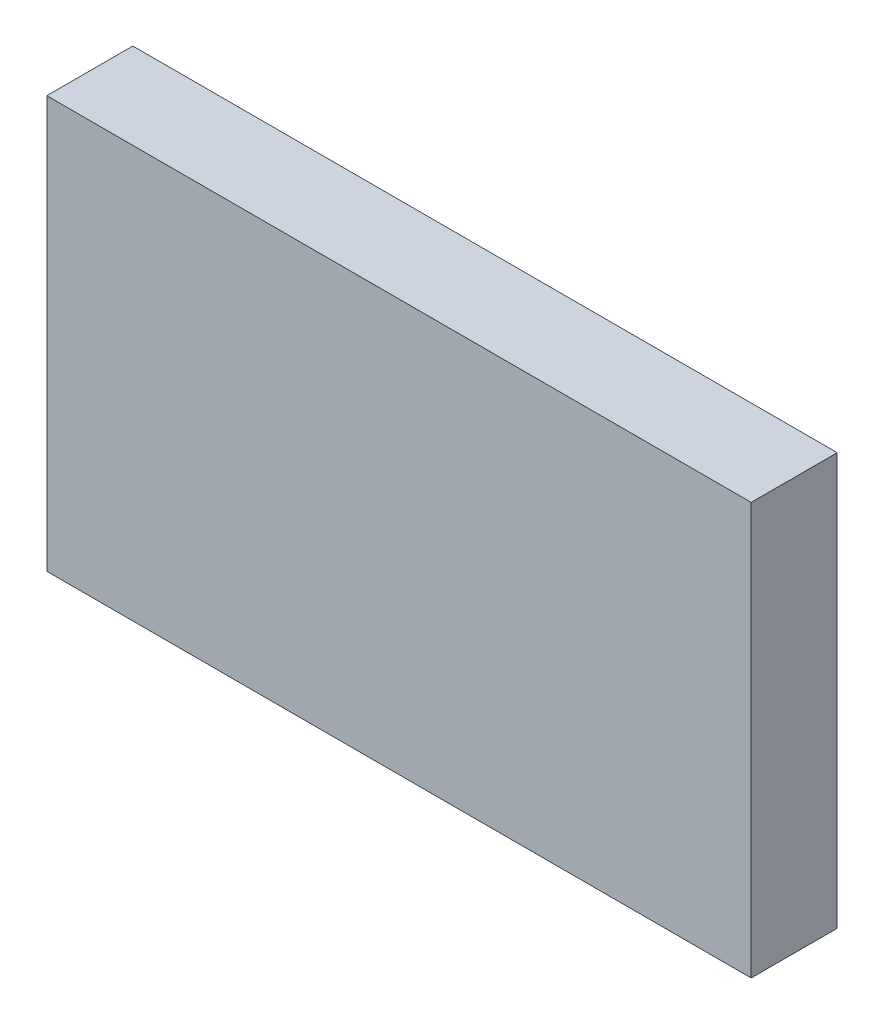
ISO-10303-21;
HEADER;
FILE_DESCRIPTION(('STEP AP214'),'2;1');
FILE_NAME('part.step','',(''),(''),'','','');
FILE_SCHEMA(('AUTOMOTIVE_DESIGN { 1 0 10303 214 1 1 1 1 }'));
ENDSEC;
DATA;
#1=APPLICATION_CONTEXT('core data for automotive mechanical design processes');
#2=APPLICATION_PROTOCOL_DEFINITION('international standard','automotive_design',2000,#1);
#3=PRODUCT_CONTEXT('',#1,'mechanical');
#4=PRODUCT('Part','Part','',(#3));
#5=PRODUCT_RELATED_PRODUCT_CATEGORY('part','',(#4));
#6=PRODUCT_DEFINITION_FORMATION('','',#4);
#7=PRODUCT_DEFINITION_CONTEXT('part definition',#1,'design');
#8=PRODUCT_DEFINITION('design','',#6,#7);
#9=PRODUCT_DEFINITION_SHAPE('','',#8);
#10=(LENGTH_UNIT() NAMED_UNIT(*) SI_UNIT(.MILLI.,.METRE.));
#11=(NAMED_UNIT(*) PLANE_ANGLE_UNIT() SI_UNIT($,.RADIAN.));
#12=(NAMED_UNIT(*) SI_UNIT($,.STERADIAN.) SOLID_ANGLE_UNIT());
#13=UNCERTAINTY_MEASURE_WITH_UNIT(LENGTH_MEASURE(1.E-05),#10,'distance_accuracy_value','');
#14=(GEOMETRIC_REPRESENTATION_CONTEXT(3) GLOBAL_UNCERTAINTY_ASSIGNED_CONTEXT((#13)) GLOBAL_UNIT_ASSIGNED_CONTEXT((#10,
#11,#12)) REPRESENTATION_CONTEXT('',''));
#15=CARTESIAN_POINT('',(0.,0.,0.));
#16=DIRECTION('',(0.,0.,1.));
#17=DIRECTION('',(1.,0.,0.));
#18=AXIS2_PLACEMENT_3D('',#15,#16,#17);
#19=CARTESIAN_POINT('',(-1.03979726,0.6079998,0.254));
#20=DIRECTION('',(0.,0.,1.));
#21=DIRECTION('',(1.,0.,0.));
#22=AXIS2_PLACEMENT_3D('',#19,#20,#21);
#23=PLANE('',#22);
#24=DIRECTION('',(2.08881647411062E-06,0.999999999997819,0.));
#25=VECTOR('',#24,1.);
#26=CARTESIAN_POINT('',(-1.0397998,-0.6079998,0.254));
#27=LINE('',#26,#25);
#28=CARTESIAN_POINT('',(-1.0397998,-0.6079998,0.254));
#29=VERTEX_POINT('',#28);
#30=CARTESIAN_POINT('',(-1.03979726,0.6079998,0.254));
#31=VERTEX_POINT('',#30);
#32=EDGE_CURVE('E27',#29,#31,#27,.T.);
#33=ORIENTED_EDGE('',*,*,#32,.F.);
#34=DIRECTION('',(-1.,0.,0.));
#35=VECTOR('',#34,1.);
#36=CARTESIAN_POINT('',(1.03980234,-0.6079998,0.254));
#37=LINE('',#36,#35);
#38=CARTESIAN_POINT('',(1.03980234,-0.6079998,0.254));
#39=VERTEX_POINT('',#38);
#40=EDGE_CURVE('E20',#39,#29,#37,.T.);
#41=ORIENTED_EDGE('',*,*,#40,.F.);
#42=DIRECTION('',(0.,-1.,0.));
#43=VECTOR('',#42,1.);
#44=CARTESIAN_POINT('',(1.03980234,0.6079998,0.254));
#45=LINE('',#44,#43);
#46=CARTESIAN_POINT('',(1.03980234,0.6079998,0.254));
#47=VERTEX_POINT('',#46);
#48=EDGE_CURVE('E90',#47,#39,#45,.T.);
#49=ORIENTED_EDGE('',*,*,#48,.F.);
#50=DIRECTION('',(1.,0.,0.));
#51=VECTOR('',#50,1.);
#52=CARTESIAN_POINT('',(-1.03979726,0.6079998,0.254));
#53=LINE('',#52,#51);
#54=EDGE_CURVE('E102',#31,#47,#53,.T.);
#55=ORIENTED_EDGE('',*,*,#54,.F.);
#56=EDGE_LOOP('',(#33,#41,#49,#55));
#57=FACE_BOUND('',#56,.T.);
#58=ADVANCED_FACE('F16',(#57),#23,.T.);
#59=CARTESIAN_POINT('',(-1.03979726,0.6079998,0.));
#60=DIRECTION('',(0.,0.,1.));
#61=DIRECTION('',(1.,0.,0.));
#62=AXIS2_PLACEMENT_3D('',#59,#60,#61);
#63=PLANE('',#62);
#64=DIRECTION('',(1.,0.,0.));
#65=VECTOR('',#64,1.);
#66=CARTESIAN_POINT('',(-1.03979726,0.6079998,0.));
#67=LINE('',#66,#65);
#68=CARTESIAN_POINT('',(-1.03979726,0.6079998,0.));
#69=VERTEX_POINT('',#68);
#70=CARTESIAN_POINT('',(1.03980234,0.6079998,0.));
#71=VERTEX_POINT('',#70);
#72=EDGE_CURVE('E85',#69,#71,#67,.T.);
#73=ORIENTED_EDGE('',*,*,#72,.T.);
#74=DIRECTION('',(0.,-1.,0.));
#75=VECTOR('',#74,1.);
#76=CARTESIAN_POINT('',(1.03980234,0.6079998,0.));
#77=LINE('',#76,#75);
#78=CARTESIAN_POINT('',(1.03980234,-0.6079998,0.));
#79=VERTEX_POINT('',#78);
#80=EDGE_CURVE('E62',#71,#79,#77,.T.);
#81=ORIENTED_EDGE('',*,*,#80,.T.);
#82=DIRECTION('',(-1.,0.,0.));
#83=VECTOR('',#82,1.);
#84=CARTESIAN_POINT('',(1.03980234,-0.6079998,0.));
#85=LINE('',#84,#83);
#86=CARTESIAN_POINT('',(-1.0397998,-0.6079998,0.));
#87=VERTEX_POINT('',#86);
#88=EDGE_CURVE('E77',#79,#87,#85,.T.);
#89=ORIENTED_EDGE('',*,*,#88,.T.);
#90=DIRECTION('',(2.08881647411062E-06,0.999999999997819,0.));
#91=VECTOR('',#90,1.);
#92=CARTESIAN_POINT('',(-1.0397998,-0.6079998,0.));
#93=LINE('',#92,#91);
#94=EDGE_CURVE('E11',#87,#69,#93,.T.);
#95=ORIENTED_EDGE('',*,*,#94,.T.);
#96=EDGE_LOOP('',(#73,#81,#89,#95));
#97=FACE_BOUND('',#96,.T.);
#98=ADVANCED_FACE('F83',(#97),#63,.F.);
#99=CARTESIAN_POINT('',(-1.0397998,-0.6079998,0.));
#100=DIRECTION('',(-0.999999999997819,2.08881647411062E-06,0.));
#101=DIRECTION('',(0.,0.,1.));
#102=AXIS2_PLACEMENT_3D('',#99,#100,#101);
#103=PLANE('',#102);
#104=DIRECTION('',(0.,0.,1.));
#105=VECTOR('',#104,1.);
#106=CARTESIAN_POINT('',(-1.0397998,-0.6079998,0.));
#107=LINE('',#106,#105);
#108=EDGE_CURVE('E80',#87,#29,#107,.T.);
#109=ORIENTED_EDGE('',*,*,#108,.T.);
#110=ORIENTED_EDGE('',*,*,#32,.T.);
#111=DIRECTION('',(0.,0.,1.));
#112=VECTOR('',#111,1.);
#113=CARTESIAN_POINT('',(-1.03979726,0.6079998,0.));
#114=LINE('',#113,#112);
#115=EDGE_CURVE('E106',#69,#31,#114,.T.);
#116=ORIENTED_EDGE('',*,*,#115,.F.);
#117=ORIENTED_EDGE('',*,*,#94,.F.);
#118=EDGE_LOOP('',(#109,#110,#116,#117));
#119=FACE_BOUND('',#118,.T.);
#120=ADVANCED_FACE('F180',(#119),#103,.T.);
#121=CARTESIAN_POINT('',(1.03980234,-0.6079998,0.));
#122=DIRECTION('',(0.,-1.,0.));
#123=DIRECTION('',(0.,0.,-1.));
#124=AXIS2_PLACEMENT_3D('',#121,#122,#123);
#125=PLANE('',#124);
#126=DIRECTION('',(0.,0.,1.));
#127=VECTOR('',#126,1.);
#128=CARTESIAN_POINT('',(1.03980234,-0.6079998,0.));
#129=LINE('',#128,#127);
#130=EDGE_CURVE('E78',#79,#39,#129,.T.);
#131=ORIENTED_EDGE('',*,*,#130,.T.);
#132=ORIENTED_EDGE('',*,*,#40,.T.);
#133=ORIENTED_EDGE('',*,*,#108,.F.);
#134=ORIENTED_EDGE('',*,*,#88,.F.);
#135=EDGE_LOOP('',(#131,#132,#133,#134));
#136=FACE_BOUND('',#135,.T.);
#137=ADVANCED_FACE('F18',(#136),#125,.T.);
#138=CARTESIAN_POINT('',(1.03980234,0.6079998,0.));
#139=DIRECTION('',(1.,0.,0.));
#140=DIRECTION('',(0.,1.,0.));
#141=AXIS2_PLACEMENT_3D('',#138,#139,#140);
#142=PLANE('',#141);
#143=DIRECTION('',(0.,0.,1.));
#144=VECTOR('',#143,1.);
#145=CARTESIAN_POINT('',(1.03980234,0.6079998,0.));
#146=LINE('',#145,#144);
#147=EDGE_CURVE('E101',#71,#47,#146,.T.);
#148=ORIENTED_EDGE('',*,*,#147,.T.);
#149=ORIENTED_EDGE('',*,*,#48,.T.);
#150=ORIENTED_EDGE('',*,*,#130,.F.);
#151=ORIENTED_EDGE('',*,*,#80,.F.);
#152=EDGE_LOOP('',(#148,#149,#150,#151));
#153=FACE_BOUND('',#152,.T.);
#154=ADVANCED_FACE('F89',(#153),#142,.T.);
#155=CARTESIAN_POINT('',(-1.03979726,0.6079998,0.));
#156=DIRECTION('',(0.,1.,0.));
#157=DIRECTION('',(1.,0.,0.));
#158=AXIS2_PLACEMENT_3D('',#155,#156,#157);
#159=PLANE('',#158);
#160=ORIENTED_EDGE('',*,*,#115,.T.);
#161=ORIENTED_EDGE('',*,*,#54,.T.);
#162=ORIENTED_EDGE('',*,*,#147,.F.);
#163=ORIENTED_EDGE('',*,*,#72,.F.);
#164=EDGE_LOOP('',(#160,#161,#162,#163));
#165=FACE_BOUND('',#164,.T.);
#166=ADVANCED_FACE('F156',(#165),#159,.T.);
#167=CLOSED_SHELL('',(#58,#98,#120,#137,#154,#166));
#168=MANIFOLD_SOLID_BREP('B1',#167);
#169=ADVANCED_BREP_SHAPE_REPRESENTATION('',(#18,#168),#14);
#170=SHAPE_DEFINITION_REPRESENTATION(#9,#169);
ENDSEC;
END-ISO-10303-21;
